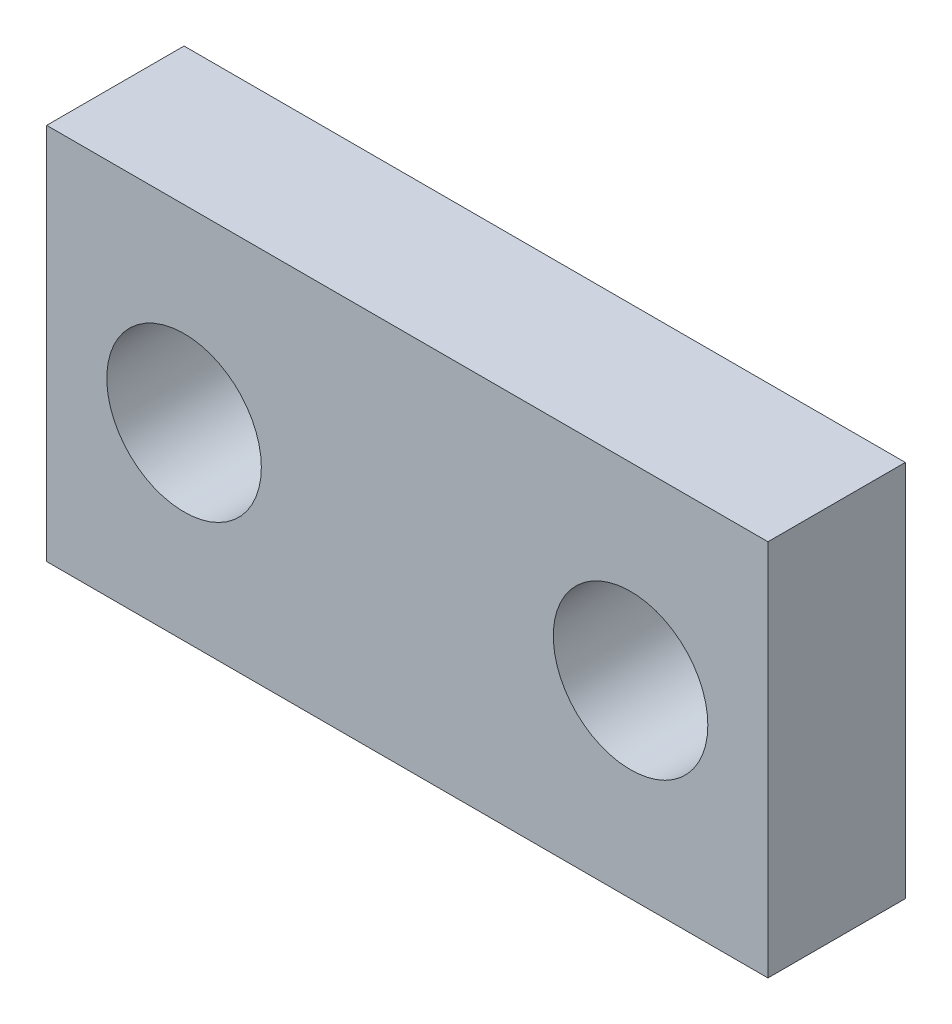
ISO-10303-21;
HEADER;
FILE_DESCRIPTION(('STEP AP214'),'2;1');
FILE_NAME('part.step','',(''),(''),'','','');
FILE_SCHEMA(('AUTOMOTIVE_DESIGN { 1 0 10303 214 1 1 1 1 }'));
ENDSEC;
DATA;
#1=APPLICATION_CONTEXT('core data for automotive mechanical design processes');
#2=APPLICATION_PROTOCOL_DEFINITION('international standard','automotive_design',2000,#1);
#3=PRODUCT_CONTEXT('',#1,'mechanical');
#4=PRODUCT('Part','Part','',(#3));
#5=PRODUCT_RELATED_PRODUCT_CATEGORY('part','',(#4));
#6=PRODUCT_DEFINITION_FORMATION('','',#4);
#7=PRODUCT_DEFINITION_CONTEXT('part definition',#1,'design');
#8=PRODUCT_DEFINITION('design','',#6,#7);
#9=PRODUCT_DEFINITION_SHAPE('','',#8);
#10=(LENGTH_UNIT() NAMED_UNIT(*) SI_UNIT(.MILLI.,.METRE.));
#11=(NAMED_UNIT(*) PLANE_ANGLE_UNIT() SI_UNIT($,.RADIAN.));
#12=(NAMED_UNIT(*) SI_UNIT($,.STERADIAN.) SOLID_ANGLE_UNIT());
#13=UNCERTAINTY_MEASURE_WITH_UNIT(LENGTH_MEASURE(1.E-05),#10,'distance_accuracy_value','');
#14=(GEOMETRIC_REPRESENTATION_CONTEXT(3) GLOBAL_UNCERTAINTY_ASSIGNED_CONTEXT((#13)) GLOBAL_UNIT_ASSIGNED_CONTEXT((#10,
#11,#12)) REPRESENTATION_CONTEXT('',''));
#15=CARTESIAN_POINT('',(0.,0.,0.));
#16=DIRECTION('',(0.,0.,1.));
#17=DIRECTION('',(1.,0.,0.));
#18=AXIS2_PLACEMENT_3D('',#15,#16,#17);
#19=CARTESIAN_POINT('',(0.,0.,4.));
#20=DIRECTION('',(0.,0.,1.));
#21=DIRECTION('',(1.,0.,0.));
#22=AXIS2_PLACEMENT_3D('',#19,#20,#21);
#23=PLANE('',#22);
#24=CARTESIAN_POINT('',(-6.5,0.,4.));
#25=DIRECTION('',(0.,0.,1.));
#26=DIRECTION('',(1.,0.,0.));
#27=AXIS2_PLACEMENT_3D('',#24,#25,#26);
#28=CIRCLE('',#27,2.25);
#29=CARTESIAN_POINT('',(-4.25,0.,4.));
#30=VERTEX_POINT('',#29);
#31=EDGE_CURVE('E101',#30,#30,#28,.T.);
#32=ORIENTED_EDGE('',*,*,#31,.F.);
#33=EDGE_LOOP('',(#32));
#34=FACE_BOUND('',#33,.T.);
#35=DIRECTION('',(0.,-1.,0.));
#36=VECTOR('',#35,1.);
#37=CARTESIAN_POINT('',(-10.5,5.5,4.));
#38=LINE('',#37,#36);
#39=CARTESIAN_POINT('',(-10.5,5.5,4.));
#40=VERTEX_POINT('',#39);
#41=CARTESIAN_POINT('',(-10.5,-5.5,4.));
#42=VERTEX_POINT('',#41);
#43=EDGE_CURVE('E86',#40,#42,#38,.T.);
#44=ORIENTED_EDGE('',*,*,#43,.T.);
#45=DIRECTION('',(1.,0.,0.));
#46=VECTOR('',#45,1.);
#47=CARTESIAN_POINT('',(-10.5,-5.5,4.));
#48=LINE('',#47,#46);
#49=CARTESIAN_POINT('',(10.5,-5.5,4.));
#50=VERTEX_POINT('',#49);
#51=EDGE_CURVE('E81',#42,#50,#48,.T.);
#52=ORIENTED_EDGE('',*,*,#51,.T.);
#53=DIRECTION('',(0.,1.,0.));
#54=VECTOR('',#53,1.);
#55=CARTESIAN_POINT('',(10.5,5.5,4.));
#56=LINE('',#55,#54);
#57=CARTESIAN_POINT('',(10.5,5.5,4.));
#58=VERTEX_POINT('',#57);
#59=EDGE_CURVE('E84',#50,#58,#56,.T.);
#60=ORIENTED_EDGE('',*,*,#59,.T.);
#61=DIRECTION('',(-1.,0.,0.));
#62=VECTOR('',#61,1.);
#63=CARTESIAN_POINT('',(-10.5,5.5,4.));
#64=LINE('',#63,#62);
#65=EDGE_CURVE('E51',#58,#40,#64,.T.);
#66=ORIENTED_EDGE('',*,*,#65,.T.);
#67=EDGE_LOOP('',(#44,#52,#60,#66));
#68=FACE_BOUND('',#67,.T.);
#69=CARTESIAN_POINT('',(6.5,0.,4.));
#70=DIRECTION('',(0.,0.,1.));
#71=DIRECTION('',(1.,0.,0.));
#72=AXIS2_PLACEMENT_3D('',#69,#70,#71);
#73=CIRCLE('',#72,2.25);
#74=CARTESIAN_POINT('',(8.75,0.,4.));
#75=VERTEX_POINT('',#74);
#76=EDGE_CURVE('E116',#75,#75,#73,.T.);
#77=ORIENTED_EDGE('',*,*,#76,.F.);
#78=EDGE_LOOP('',(#77));
#79=FACE_BOUND('',#78,.T.);
#80=ADVANCED_FACE('F34',(#34,#68,#79),#23,.T.);
#81=CARTESIAN_POINT('',(0.,0.,0.));
#82=DIRECTION('',(0.,0.,1.));
#83=DIRECTION('',(1.,0.,0.));
#84=AXIS2_PLACEMENT_3D('',#81,#82,#83);
#85=PLANE('',#84);
#86=CARTESIAN_POINT('',(-6.5,0.,0.));
#87=DIRECTION('',(0.,0.,1.));
#88=DIRECTION('',(1.,0.,0.));
#89=AXIS2_PLACEMENT_3D('',#86,#87,#88);
#90=CIRCLE('',#89,2.25);
#91=CARTESIAN_POINT('',(-4.25,0.,0.));
#92=VERTEX_POINT('',#91);
#93=EDGE_CURVE('E113',#92,#92,#90,.T.);
#94=ORIENTED_EDGE('',*,*,#93,.T.);
#95=EDGE_LOOP('',(#94));
#96=FACE_BOUND('',#95,.T.);
#97=DIRECTION('',(0.,-1.,0.));
#98=VECTOR('',#97,1.);
#99=CARTESIAN_POINT('',(-10.5,5.5,0.));
#100=LINE('',#99,#98);
#101=CARTESIAN_POINT('',(-10.5,5.5,0.));
#102=VERTEX_POINT('',#101);
#103=CARTESIAN_POINT('',(-10.5,-5.5,0.));
#104=VERTEX_POINT('',#103);
#105=EDGE_CURVE('E98',#102,#104,#100,.T.);
#106=ORIENTED_EDGE('',*,*,#105,.F.);
#107=DIRECTION('',(-1.,0.,0.));
#108=VECTOR('',#107,1.);
#109=CARTESIAN_POINT('',(-10.5,5.5,0.));
#110=LINE('',#109,#108);
#111=CARTESIAN_POINT('',(10.5,5.5,0.));
#112=VERTEX_POINT('',#111);
#113=EDGE_CURVE('E74',#112,#102,#110,.T.);
#114=ORIENTED_EDGE('',*,*,#113,.F.);
#115=DIRECTION('',(0.,1.,0.));
#116=VECTOR('',#115,1.);
#117=CARTESIAN_POINT('',(10.5,5.5,0.));
#118=LINE('',#117,#116);
#119=CARTESIAN_POINT('',(10.5,-5.5,0.));
#120=VERTEX_POINT('',#119);
#121=EDGE_CURVE('E68',#120,#112,#118,.T.);
#122=ORIENTED_EDGE('',*,*,#121,.F.);
#123=DIRECTION('',(1.,0.,0.));
#124=VECTOR('',#123,1.);
#125=CARTESIAN_POINT('',(-10.5,-5.5,0.));
#126=LINE('',#125,#124);
#127=EDGE_CURVE('E90',#104,#120,#126,.T.);
#128=ORIENTED_EDGE('',*,*,#127,.F.);
#129=EDGE_LOOP('',(#106,#114,#122,#128));
#130=FACE_BOUND('',#129,.T.);
#131=CARTESIAN_POINT('',(6.5,0.,0.));
#132=DIRECTION('',(0.,0.,1.));
#133=DIRECTION('',(1.,0.,0.));
#134=AXIS2_PLACEMENT_3D('',#131,#132,#133);
#135=CIRCLE('',#134,2.25);
#136=CARTESIAN_POINT('',(8.75,0.,0.));
#137=VERTEX_POINT('',#136);
#138=EDGE_CURVE('E119',#137,#137,#135,.T.);
#139=ORIENTED_EDGE('',*,*,#138,.T.);
#140=EDGE_LOOP('',(#139));
#141=FACE_BOUND('',#140,.T.);
#142=ADVANCED_FACE('F109',(#96,#130,#141),#85,.F.);
#143=CARTESIAN_POINT('',(-10.5,5.5,4.));
#144=DIRECTION('',(1.,0.,0.));
#145=DIRECTION('',(0.,1.,0.));
#146=AXIS2_PLACEMENT_3D('',#143,#144,#145);
#147=PLANE('',#146);
#148=ORIENTED_EDGE('',*,*,#105,.T.);
#149=DIRECTION('',(0.,0.,-1.));
#150=VECTOR('',#149,1.);
#151=CARTESIAN_POINT('',(-10.5,-5.5,4.));
#152=LINE('',#151,#150);
#153=EDGE_CURVE('E11',#42,#104,#152,.T.);
#154=ORIENTED_EDGE('',*,*,#153,.F.);
#155=ORIENTED_EDGE('',*,*,#43,.F.);
#156=DIRECTION('',(0.,0.,-1.));
#157=VECTOR('',#156,1.);
#158=CARTESIAN_POINT('',(-10.5,5.5,4.));
#159=LINE('',#158,#157);
#160=EDGE_CURVE('E94',#40,#102,#159,.T.);
#161=ORIENTED_EDGE('',*,*,#160,.T.);
#162=EDGE_LOOP('',(#148,#154,#155,#161));
#163=FACE_BOUND('',#162,.T.);
#164=ADVANCED_FACE('F36',(#163),#147,.F.);
#165=CARTESIAN_POINT('',(-10.5,-5.5,4.));
#166=DIRECTION('',(0.,1.,0.));
#167=DIRECTION('',(0.,0.,1.));
#168=AXIS2_PLACEMENT_3D('',#165,#166,#167);
#169=PLANE('',#168);
#170=ORIENTED_EDGE('',*,*,#127,.T.);
#171=DIRECTION('',(0.,0.,-1.));
#172=VECTOR('',#171,1.);
#173=CARTESIAN_POINT('',(10.5,-5.5,4.));
#174=LINE('',#173,#172);
#175=EDGE_CURVE('E43',#50,#120,#174,.T.);
#176=ORIENTED_EDGE('',*,*,#175,.F.);
#177=ORIENTED_EDGE('',*,*,#51,.F.);
#178=ORIENTED_EDGE('',*,*,#153,.T.);
#179=EDGE_LOOP('',(#170,#176,#177,#178));
#180=FACE_BOUND('',#179,.T.);
#181=ADVANCED_FACE('F89',(#180),#169,.F.);
#182=CARTESIAN_POINT('',(10.5,5.5,4.));
#183=DIRECTION('',(-1.,0.,0.));
#184=DIRECTION('',(0.,-1.,0.));
#185=AXIS2_PLACEMENT_3D('',#182,#183,#184);
#186=PLANE('',#185);
#187=ORIENTED_EDGE('',*,*,#121,.T.);
#188=DIRECTION('',(0.,0.,-1.));
#189=VECTOR('',#188,1.);
#190=CARTESIAN_POINT('',(10.5,5.5,4.));
#191=LINE('',#190,#189);
#192=EDGE_CURVE('E91',#58,#112,#191,.T.);
#193=ORIENTED_EDGE('',*,*,#192,.F.);
#194=ORIENTED_EDGE('',*,*,#59,.F.);
#195=ORIENTED_EDGE('',*,*,#175,.T.);
#196=EDGE_LOOP('',(#187,#193,#194,#195));
#197=FACE_BOUND('',#196,.T.);
#198=ADVANCED_FACE('F92',(#197),#186,.F.);
#199=CARTESIAN_POINT('',(-10.5,5.5,4.));
#200=DIRECTION('',(0.,-1.,0.));
#201=DIRECTION('',(0.,0.,-1.));
#202=AXIS2_PLACEMENT_3D('',#199,#200,#201);
#203=PLANE('',#202);
#204=ORIENTED_EDGE('',*,*,#113,.T.);
#205=ORIENTED_EDGE('',*,*,#160,.F.);
#206=ORIENTED_EDGE('',*,*,#65,.F.);
#207=ORIENTED_EDGE('',*,*,#192,.T.);
#208=EDGE_LOOP('',(#204,#205,#206,#207));
#209=FACE_BOUND('',#208,.T.);
#210=ADVANCED_FACE('F106',(#209),#203,.F.);
#211=CARTESIAN_POINT('',(-6.5,0.,4.));
#212=DIRECTION('',(0.,0.,-1.));
#213=DIRECTION('',(-1.,0.,0.));
#214=AXIS2_PLACEMENT_3D('',#211,#212,#213);
#215=CYLINDRICAL_SURFACE('',#214,2.25);
#216=ORIENTED_EDGE('',*,*,#31,.T.);
#217=EDGE_LOOP('',(#216));
#218=FACE_BOUND('',#217,.T.);
#219=ORIENTED_EDGE('',*,*,#93,.F.);
#220=EDGE_LOOP('',(#219));
#221=FACE_BOUND('',#220,.T.);
#222=ADVANCED_FACE('F137',(#218,#221),#215,.F.);
#223=CARTESIAN_POINT('',(6.5,0.,4.));
#224=DIRECTION('',(0.,0.,-1.));
#225=DIRECTION('',(-1.,0.,0.));
#226=AXIS2_PLACEMENT_3D('',#223,#224,#225);
#227=CYLINDRICAL_SURFACE('',#226,2.25);
#228=ORIENTED_EDGE('',*,*,#76,.T.);
#229=EDGE_LOOP('',(#228));
#230=FACE_BOUND('',#229,.T.);
#231=ORIENTED_EDGE('',*,*,#138,.F.);
#232=EDGE_LOOP('',(#231));
#233=FACE_BOUND('',#232,.T.);
#234=ADVANCED_FACE('F125',(#230,#233),#227,.F.);
#235=CLOSED_SHELL('',(#80,#142,#164,#181,#198,#210,#222,#234));
#236=MANIFOLD_SOLID_BREP('B2',#235);
#237=ADVANCED_BREP_SHAPE_REPRESENTATION('',(#18,#236),#14);
#238=SHAPE_DEFINITION_REPRESENTATION(#9,#237);
ENDSEC;
END-ISO-10303-21;
